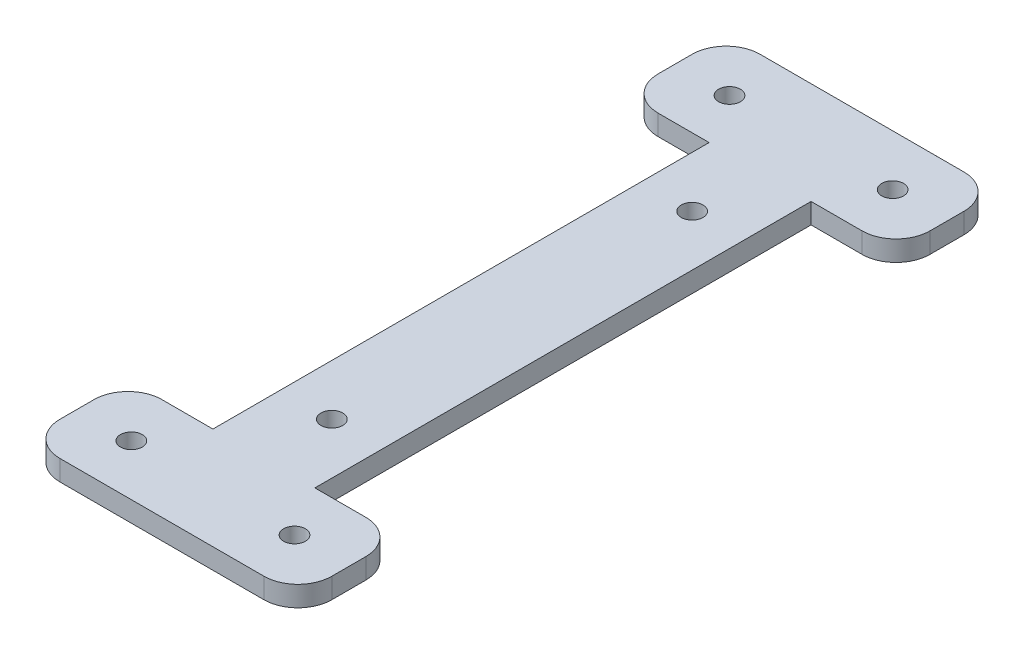
ISO-10303-21;
HEADER;
FILE_DESCRIPTION(('STEP AP214'),'2;1');
FILE_NAME('part.step','',(''),(''),'','','');
FILE_SCHEMA(('AUTOMOTIVE_DESIGN { 1 0 10303 214 1 1 1 1 }'));
ENDSEC;
DATA;
#1=APPLICATION_CONTEXT('core data for automotive mechanical design processes');
#2=APPLICATION_PROTOCOL_DEFINITION('international standard','automotive_design',2000,#1);
#3=PRODUCT_CONTEXT('',#1,'mechanical');
#4=PRODUCT('Part','Part','',(#3));
#5=PRODUCT_RELATED_PRODUCT_CATEGORY('part','',(#4));
#6=PRODUCT_DEFINITION_FORMATION('','',#4);
#7=PRODUCT_DEFINITION_CONTEXT('part definition',#1,'design');
#8=PRODUCT_DEFINITION('design','',#6,#7);
#9=PRODUCT_DEFINITION_SHAPE('','',#8);
#10=(LENGTH_UNIT() NAMED_UNIT(*) SI_UNIT(.MILLI.,.METRE.));
#11=(NAMED_UNIT(*) PLANE_ANGLE_UNIT() SI_UNIT($,.RADIAN.));
#12=(NAMED_UNIT(*) SI_UNIT($,.STERADIAN.) SOLID_ANGLE_UNIT());
#13=UNCERTAINTY_MEASURE_WITH_UNIT(LENGTH_MEASURE(1.E-05),#10,'distance_accuracy_value','');
#14=(GEOMETRIC_REPRESENTATION_CONTEXT(3) GLOBAL_UNCERTAINTY_ASSIGNED_CONTEXT((#13)) GLOBAL_UNIT_ASSIGNED_CONTEXT((#10,
#11,#12)) REPRESENTATION_CONTEXT('',''));
#15=CARTESIAN_POINT('',(0.,0.,0.));
#16=DIRECTION('',(0.,0.,1.));
#17=DIRECTION('',(1.,0.,0.));
#18=AXIS2_PLACEMENT_3D('',#15,#16,#17);
#19=CARTESIAN_POINT('',(40.,3.,0.));
#20=DIRECTION('',(1.,0.,0.));
#21=DIRECTION('',(0.,0.,-1.));
#22=AXIS2_PLACEMENT_3D('',#19,#20,#21);
#23=PLANE('',#22);
#24=DIRECTION('',(0.,0.,1.));
#25=VECTOR('',#24,1.);
#26=CARTESIAN_POINT('',(40.,0.,0.));
#27=LINE('',#26,#25);
#28=CARTESIAN_POINT('',(40.,0.,-98.));
#29=VERTEX_POINT('',#28);
#30=CARTESIAN_POINT('',(40.,0.,-93.));
#31=VERTEX_POINT('',#30);
#32=EDGE_CURVE('E248',#29,#31,#27,.T.);
#33=ORIENTED_EDGE('',*,*,#32,.F.);
#34=DIRECTION('',(0.,-1.,0.));
#35=VECTOR('',#34,1.);
#36=CARTESIAN_POINT('',(40.,3.,-98.));
#37=LINE('',#36,#35);
#38=CARTESIAN_POINT('',(40.,3.,-98.));
#39=VERTEX_POINT('',#38);
#40=EDGE_CURVE('E356',#29,#39,#37,.F.);
#41=ORIENTED_EDGE('',*,*,#40,.T.);
#42=DIRECTION('',(0.,0.,1.));
#43=VECTOR('',#42,1.);
#44=CARTESIAN_POINT('',(40.,3.,0.));
#45=LINE('',#44,#43);
#46=CARTESIAN_POINT('',(40.,3.,-93.));
#47=VERTEX_POINT('',#46);
#48=EDGE_CURVE('E293',#39,#47,#45,.T.);
#49=ORIENTED_EDGE('',*,*,#48,.T.);
#50=DIRECTION('',(0.,-1.,0.));
#51=VECTOR('',#50,1.);
#52=CARTESIAN_POINT('',(40.,0.,-93.));
#53=LINE('',#52,#51);
#54=EDGE_CURVE('E353',#47,#31,#53,.T.);
#55=ORIENTED_EDGE('',*,*,#54,.T.);
#56=EDGE_LOOP('',(#33,#41,#49,#55));
#57=FACE_BOUND('',#56,.T.);
#58=ADVANCED_FACE('F43',(#57),#23,.T.);
#59=CARTESIAN_POINT('',(0.,3.,-103.));
#60=DIRECTION('',(0.,0.,-1.));
#61=DIRECTION('',(-1.,0.,0.));
#62=AXIS2_PLACEMENT_3D('',#59,#60,#61);
#63=PLANE('',#62);
#64=DIRECTION('',(1.,0.,0.));
#65=VECTOR('',#64,1.);
#66=CARTESIAN_POINT('',(0.,0.,-103.));
#67=LINE('',#66,#65);
#68=CARTESIAN_POINT('',(5.,0.,-103.));
#69=VERTEX_POINT('',#68);
#70=CARTESIAN_POINT('',(35.,0.,-103.));
#71=VERTEX_POINT('',#70);
#72=EDGE_CURVE('E251',#69,#71,#67,.T.);
#73=ORIENTED_EDGE('',*,*,#72,.F.);
#74=DIRECTION('',(0.,-1.,0.));
#75=VECTOR('',#74,1.);
#76=CARTESIAN_POINT('',(5.,3.,-103.));
#77=LINE('',#76,#75);
#78=CARTESIAN_POINT('',(5.,3.,-103.));
#79=VERTEX_POINT('',#78);
#80=EDGE_CURVE('E322',#69,#79,#77,.F.);
#81=ORIENTED_EDGE('',*,*,#80,.T.);
#82=DIRECTION('',(1.,0.,0.));
#83=VECTOR('',#82,1.);
#84=CARTESIAN_POINT('',(0.,3.,-103.));
#85=LINE('',#84,#83);
#86=CARTESIAN_POINT('',(35.,3.,-103.));
#87=VERTEX_POINT('',#86);
#88=EDGE_CURVE('E415',#79,#87,#85,.T.);
#89=ORIENTED_EDGE('',*,*,#88,.T.);
#90=DIRECTION('',(0.,-1.,0.));
#91=VECTOR('',#90,1.);
#92=CARTESIAN_POINT('',(35.,3.,-103.));
#93=LINE('',#92,#91);
#94=EDGE_CURVE('E319',#87,#71,#93,.T.);
#95=ORIENTED_EDGE('',*,*,#94,.T.);
#96=EDGE_LOOP('',(#73,#81,#89,#95));
#97=FACE_BOUND('',#96,.T.);
#98=ADVANCED_FACE('F413',(#97),#63,.T.);
#99=CARTESIAN_POINT('',(0.,3.,0.));
#100=DIRECTION('',(1.,0.,0.));
#101=DIRECTION('',(0.,0.,-1.));
#102=AXIS2_PLACEMENT_3D('',#99,#100,#101);
#103=PLANE('',#102);
#104=DIRECTION('',(0.,0.,1.));
#105=VECTOR('',#104,1.);
#106=CARTESIAN_POINT('',(0.,3.,0.));
#107=LINE('',#106,#105);
#108=CARTESIAN_POINT('',(0.,3.,-98.));
#109=VERTEX_POINT('',#108);
#110=CARTESIAN_POINT('',(0.,3.,-93.));
#111=VERTEX_POINT('',#110);
#112=EDGE_CURVE('E196',#109,#111,#107,.T.);
#113=ORIENTED_EDGE('',*,*,#112,.F.);
#114=DIRECTION('',(0.,-1.,0.));
#115=VECTOR('',#114,1.);
#116=CARTESIAN_POINT('',(0.,0.,-98.));
#117=LINE('',#116,#115);
#118=CARTESIAN_POINT('',(0.,0.,-98.));
#119=VERTEX_POINT('',#118);
#120=EDGE_CURVE('E300',#109,#119,#117,.T.);
#121=ORIENTED_EDGE('',*,*,#120,.T.);
#122=DIRECTION('',(0.,0.,1.));
#123=VECTOR('',#122,1.);
#124=CARTESIAN_POINT('',(0.,0.,0.));
#125=LINE('',#124,#123);
#126=CARTESIAN_POINT('',(0.,0.,-93.));
#127=VERTEX_POINT('',#126);
#128=EDGE_CURVE('E254',#119,#127,#125,.T.);
#129=ORIENTED_EDGE('',*,*,#128,.T.);
#130=DIRECTION('',(0.,-1.,0.));
#131=VECTOR('',#130,1.);
#132=CARTESIAN_POINT('',(0.,3.,-93.));
#133=LINE('',#132,#131);
#134=EDGE_CURVE('E207',#127,#111,#133,.F.);
#135=ORIENTED_EDGE('',*,*,#134,.T.);
#136=EDGE_LOOP('',(#113,#121,#129,#135));
#137=FACE_BOUND('',#136,.T.);
#138=ADVANCED_FACE('F446',(#137),#103,.F.);
#139=CARTESIAN_POINT('',(0.,3.,-88.));
#140=DIRECTION('',(0.,0.,-1.));
#141=DIRECTION('',(-1.,0.,0.));
#142=AXIS2_PLACEMENT_3D('',#139,#140,#141);
#143=PLANE('',#142);
#144=DIRECTION('',(1.,0.,0.));
#145=VECTOR('',#144,1.);
#146=CARTESIAN_POINT('',(0.,3.,-88.));
#147=LINE('',#146,#145);
#148=CARTESIAN_POINT('',(5.,3.,-88.));
#149=VERTEX_POINT('',#148);
#150=CARTESIAN_POINT('',(12.5,3.,-88.));
#151=VERTEX_POINT('',#150);
#152=EDGE_CURVE('E182',#149,#151,#147,.T.);
#153=ORIENTED_EDGE('',*,*,#152,.F.);
#154=DIRECTION('',(0.,-1.,0.));
#155=VECTOR('',#154,1.);
#156=CARTESIAN_POINT('',(5.,3.,-88.));
#157=LINE('',#156,#155);
#158=CARTESIAN_POINT('',(5.,0.,-88.));
#159=VERTEX_POINT('',#158);
#160=EDGE_CURVE('E358',#149,#159,#157,.T.);
#161=ORIENTED_EDGE('',*,*,#160,.T.);
#162=DIRECTION('',(1.,0.,0.));
#163=VECTOR('',#162,1.);
#164=CARTESIAN_POINT('',(0.,0.,-88.));
#165=LINE('',#164,#163);
#166=CARTESIAN_POINT('',(12.5,0.,-88.));
#167=VERTEX_POINT('',#166);
#168=EDGE_CURVE('E203',#159,#167,#165,.T.);
#169=ORIENTED_EDGE('',*,*,#168,.T.);
#170=DIRECTION('',(0.,-1.,0.));
#171=VECTOR('',#170,1.);
#172=CARTESIAN_POINT('',(12.5,3.,-88.));
#173=LINE('',#172,#171);
#174=EDGE_CURVE('E200',#151,#167,#173,.T.);
#175=ORIENTED_EDGE('',*,*,#174,.F.);
#176=EDGE_LOOP('',(#153,#161,#169,#175));
#177=FACE_BOUND('',#176,.T.);
#178=ADVANCED_FACE('F201',(#177),#143,.F.);
#179=CARTESIAN_POINT('',(12.5,3.,0.));
#180=DIRECTION('',(-1.,0.,0.));
#181=DIRECTION('',(0.,0.,1.));
#182=AXIS2_PLACEMENT_3D('',#179,#180,#181);
#183=PLANE('',#182);
#184=DIRECTION('',(0.,0.,-1.));
#185=VECTOR('',#184,1.);
#186=CARTESIAN_POINT('',(12.5,0.,0.));
#187=LINE('',#186,#185);
#188=CARTESIAN_POINT('',(12.5,0.,-15.));
#189=VERTEX_POINT('',#188);
#190=EDGE_CURVE('E258',#189,#167,#187,.T.);
#191=ORIENTED_EDGE('',*,*,#190,.F.);
#192=DIRECTION('',(0.,-1.,0.));
#193=VECTOR('',#192,1.);
#194=CARTESIAN_POINT('',(12.5,3.,-15.));
#195=LINE('',#194,#193);
#196=CARTESIAN_POINT('',(12.5,3.,-15.));
#197=VERTEX_POINT('',#196);
#198=EDGE_CURVE('E208',#197,#189,#195,.T.);
#199=ORIENTED_EDGE('',*,*,#198,.F.);
#200=DIRECTION('',(0.,0.,-1.));
#201=VECTOR('',#200,1.);
#202=CARTESIAN_POINT('',(12.5,3.,0.));
#203=LINE('',#202,#201);
#204=EDGE_CURVE('E189',#197,#151,#203,.T.);
#205=ORIENTED_EDGE('',*,*,#204,.T.);
#206=ORIENTED_EDGE('',*,*,#174,.T.);
#207=EDGE_LOOP('',(#191,#199,#205,#206));
#208=FACE_BOUND('',#207,.T.);
#209=ADVANCED_FACE('F211',(#208),#183,.T.);
#210=CARTESIAN_POINT('',(0.,3.,-15.));
#211=DIRECTION('',(0.,0.,-1.));
#212=DIRECTION('',(-1.,0.,0.));
#213=AXIS2_PLACEMENT_3D('',#210,#211,#212);
#214=PLANE('',#213);
#215=DIRECTION('',(1.,0.,0.));
#216=VECTOR('',#215,1.);
#217=CARTESIAN_POINT('',(0.,0.,-15.));
#218=LINE('',#217,#216);
#219=CARTESIAN_POINT('',(5.,0.,-15.));
#220=VERTEX_POINT('',#219);
#221=EDGE_CURVE('E261',#220,#189,#218,.T.);
#222=ORIENTED_EDGE('',*,*,#221,.F.);
#223=DIRECTION('',(0.,-1.,0.));
#224=VECTOR('',#223,1.);
#225=CARTESIAN_POINT('',(5.,3.,-15.));
#226=LINE('',#225,#224);
#227=CARTESIAN_POINT('',(5.,3.,-15.));
#228=VERTEX_POINT('',#227);
#229=EDGE_CURVE('E351',#220,#228,#226,.F.);
#230=ORIENTED_EDGE('',*,*,#229,.T.);
#231=DIRECTION('',(1.,0.,0.));
#232=VECTOR('',#231,1.);
#233=CARTESIAN_POINT('',(0.,3.,-15.));
#234=LINE('',#233,#232);
#235=EDGE_CURVE('E213',#228,#197,#234,.T.);
#236=ORIENTED_EDGE('',*,*,#235,.T.);
#237=ORIENTED_EDGE('',*,*,#198,.T.);
#238=EDGE_LOOP('',(#222,#230,#236,#237));
#239=FACE_BOUND('',#238,.T.);
#240=ADVANCED_FACE('F428',(#239),#214,.T.);
#241=CARTESIAN_POINT('',(0.,3.,0.));
#242=DIRECTION('',(-1.,0.,0.));
#243=DIRECTION('',(0.,0.,1.));
#244=AXIS2_PLACEMENT_3D('',#241,#242,#243);
#245=PLANE('',#244);
#246=DIRECTION('',(0.,0.,-1.));
#247=VECTOR('',#246,1.);
#248=CARTESIAN_POINT('',(0.,3.,0.));
#249=LINE('',#248,#247);
#250=CARTESIAN_POINT('',(0.,3.,-5.));
#251=VERTEX_POINT('',#250);
#252=CARTESIAN_POINT('',(0.,3.,-10.));
#253=VERTEX_POINT('',#252);
#254=EDGE_CURVE('E215',#251,#253,#249,.T.);
#255=ORIENTED_EDGE('',*,*,#254,.T.);
#256=DIRECTION('',(0.,-1.,0.));
#257=VECTOR('',#256,1.);
#258=CARTESIAN_POINT('',(0.,3.,-10.));
#259=LINE('',#258,#257);
#260=CARTESIAN_POINT('',(0.,0.,-10.));
#261=VERTEX_POINT('',#260);
#262=EDGE_CURVE('E348',#253,#261,#259,.T.);
#263=ORIENTED_EDGE('',*,*,#262,.T.);
#264=DIRECTION('',(0.,0.,-1.));
#265=VECTOR('',#264,1.);
#266=CARTESIAN_POINT('',(0.,0.,0.));
#267=LINE('',#266,#265);
#268=CARTESIAN_POINT('',(0.,0.,-5.));
#269=VERTEX_POINT('',#268);
#270=EDGE_CURVE('E263',#269,#261,#267,.T.);
#271=ORIENTED_EDGE('',*,*,#270,.F.);
#272=DIRECTION('',(0.,-1.,0.));
#273=VECTOR('',#272,1.);
#274=CARTESIAN_POINT('',(0.,3.,-5.));
#275=LINE('',#274,#273);
#276=EDGE_CURVE('E346',#269,#251,#275,.F.);
#277=ORIENTED_EDGE('',*,*,#276,.T.);
#278=EDGE_LOOP('',(#255,#263,#271,#277));
#279=FACE_BOUND('',#278,.T.);
#280=ADVANCED_FACE('F435',(#279),#245,.T.);
#281=CARTESIAN_POINT('',(0.,3.,0.));
#282=DIRECTION('',(0.,0.,-1.));
#283=DIRECTION('',(-1.,0.,0.));
#284=AXIS2_PLACEMENT_3D('',#281,#282,#283);
#285=PLANE('',#284);
#286=DIRECTION('',(1.,0.,0.));
#287=VECTOR('',#286,1.);
#288=CARTESIAN_POINT('',(0.,0.,0.));
#289=LINE('',#288,#287);
#290=CARTESIAN_POINT('',(5.,0.,0.));
#291=VERTEX_POINT('',#290);
#292=CARTESIAN_POINT('',(35.,0.,0.));
#293=VERTEX_POINT('',#292);
#294=EDGE_CURVE('E267',#291,#293,#289,.T.);
#295=ORIENTED_EDGE('',*,*,#294,.T.);
#296=DIRECTION('',(0.,-1.,0.));
#297=VECTOR('',#296,1.);
#298=CARTESIAN_POINT('',(35.,3.,0.));
#299=LINE('',#298,#297);
#300=CARTESIAN_POINT('',(35.,3.,0.));
#301=VERTEX_POINT('',#300);
#302=EDGE_CURVE('E11',#293,#301,#299,.F.);
#303=ORIENTED_EDGE('',*,*,#302,.T.);
#304=DIRECTION('',(1.,0.,0.));
#305=VECTOR('',#304,1.);
#306=CARTESIAN_POINT('',(0.,3.,0.));
#307=LINE('',#306,#305);
#308=CARTESIAN_POINT('',(5.,3.,0.));
#309=VERTEX_POINT('',#308);
#310=EDGE_CURVE('E222',#309,#301,#307,.T.);
#311=ORIENTED_EDGE('',*,*,#310,.F.);
#312=DIRECTION('',(0.,-1.,0.));
#313=VECTOR('',#312,1.);
#314=CARTESIAN_POINT('',(5.,0.,0.));
#315=LINE('',#314,#313);
#316=EDGE_CURVE('E51',#309,#291,#315,.T.);
#317=ORIENTED_EDGE('',*,*,#316,.T.);
#318=EDGE_LOOP('',(#295,#303,#311,#317));
#319=FACE_BOUND('',#318,.T.);
#320=ADVANCED_FACE('F365',(#319),#285,.F.);
#321=CARTESIAN_POINT('',(40.,3.,0.));
#322=DIRECTION('',(-1.,0.,0.));
#323=DIRECTION('',(0.,0.,1.));
#324=AXIS2_PLACEMENT_3D('',#321,#322,#323);
#325=PLANE('',#324);
#326=DIRECTION('',(0.,0.,-1.));
#327=VECTOR('',#326,1.);
#328=CARTESIAN_POINT('',(40.,0.,0.));
#329=LINE('',#328,#327);
#330=CARTESIAN_POINT('',(40.,0.,-5.00000000000001));
#331=VERTEX_POINT('',#330);
#332=CARTESIAN_POINT('',(40.,0.,-10.));
#333=VERTEX_POINT('',#332);
#334=EDGE_CURVE('E270',#331,#333,#329,.T.);
#335=ORIENTED_EDGE('',*,*,#334,.T.);
#336=DIRECTION('',(0.,-1.,0.));
#337=VECTOR('',#336,1.);
#338=CARTESIAN_POINT('',(40.,3.,-10.));
#339=LINE('',#338,#337);
#340=CARTESIAN_POINT('',(40.,3.,-10.));
#341=VERTEX_POINT('',#340);
#342=EDGE_CURVE('E344',#333,#341,#339,.F.);
#343=ORIENTED_EDGE('',*,*,#342,.T.);
#344=DIRECTION('',(0.,0.,-1.));
#345=VECTOR('',#344,1.);
#346=CARTESIAN_POINT('',(40.,3.,0.));
#347=LINE('',#346,#345);
#348=CARTESIAN_POINT('',(40.,3.,-5.00000000000001));
#349=VERTEX_POINT('',#348);
#350=EDGE_CURVE('E225',#349,#341,#347,.T.);
#351=ORIENTED_EDGE('',*,*,#350,.F.);
#352=DIRECTION('',(0.,-1.,0.));
#353=VECTOR('',#352,1.);
#354=CARTESIAN_POINT('',(40.,3.,-5.00000000000001));
#355=LINE('',#354,#353);
#356=EDGE_CURVE('E341',#349,#331,#355,.T.);
#357=ORIENTED_EDGE('',*,*,#356,.T.);
#358=EDGE_LOOP('',(#335,#343,#351,#357));
#359=FACE_BOUND('',#358,.T.);
#360=ADVANCED_FACE('F381',(#359),#325,.F.);
#361=CARTESIAN_POINT('',(27.5,3.,-15.));
#362=VERTEX_POINT('',#361);
#363=CARTESIAN_POINT('',(35.,3.,-15.));
#364=VERTEX_POINT('',#363);
#365=EDGE_CURVE('E217',#362,#364,#234,.T.);
#366=ORIENTED_EDGE('',*,*,#365,.T.);
#367=DIRECTION('',(0.,-1.,0.));
#368=VECTOR('',#367,1.);
#369=CARTESIAN_POINT('',(35.,0.,-15.));
#370=LINE('',#369,#368);
#371=CARTESIAN_POINT('',(35.,0.,-15.));
#372=VERTEX_POINT('',#371);
#373=EDGE_CURVE('E338',#364,#372,#370,.T.);
#374=ORIENTED_EDGE('',*,*,#373,.T.);
#375=CARTESIAN_POINT('',(27.5,0.,-15.));
#376=VERTEX_POINT('',#375);
#377=EDGE_CURVE('E264',#376,#372,#218,.T.);
#378=ORIENTED_EDGE('',*,*,#377,.F.);
#379=DIRECTION('',(0.,-1.,0.));
#380=VECTOR('',#379,1.);
#381=CARTESIAN_POINT('',(27.5,3.,-15.));
#382=LINE('',#381,#380);
#383=EDGE_CURVE('E296',#362,#376,#382,.T.);
#384=ORIENTED_EDGE('',*,*,#383,.F.);
#385=EDGE_LOOP('',(#366,#374,#378,#384));
#386=FACE_BOUND('',#385,.T.);
#387=ADVANCED_FACE('F389',(#386),#214,.T.);
#388=CARTESIAN_POINT('',(27.5,3.,0.));
#389=DIRECTION('',(-1.,0.,0.));
#390=DIRECTION('',(0.,0.,1.));
#391=AXIS2_PLACEMENT_3D('',#388,#389,#390);
#392=PLANE('',#391);
#393=DIRECTION('',(0.,0.,-1.));
#394=VECTOR('',#393,1.);
#395=CARTESIAN_POINT('',(27.5,0.,0.));
#396=LINE('',#395,#394);
#397=CARTESIAN_POINT('',(27.5,0.,-88.));
#398=VERTEX_POINT('',#397);
#399=EDGE_CURVE('E273',#376,#398,#396,.T.);
#400=ORIENTED_EDGE('',*,*,#399,.T.);
#401=DIRECTION('',(0.,-1.,0.));
#402=VECTOR('',#401,1.);
#403=CARTESIAN_POINT('',(27.5,3.,-88.));
#404=LINE('',#403,#402);
#405=CARTESIAN_POINT('',(27.5,3.,-88.));
#406=VERTEX_POINT('',#405);
#407=EDGE_CURVE('E247',#406,#398,#404,.T.);
#408=ORIENTED_EDGE('',*,*,#407,.F.);
#409=DIRECTION('',(0.,0.,-1.));
#410=VECTOR('',#409,1.);
#411=CARTESIAN_POINT('',(27.5,3.,0.));
#412=LINE('',#411,#410);
#413=EDGE_CURVE('E227',#362,#406,#412,.T.);
#414=ORIENTED_EDGE('',*,*,#413,.F.);
#415=ORIENTED_EDGE('',*,*,#383,.T.);
#416=EDGE_LOOP('',(#400,#408,#414,#415));
#417=FACE_BOUND('',#416,.T.);
#418=ADVANCED_FACE('F394',(#417),#392,.F.);
#419=CARTESIAN_POINT('',(8.,3.,-7.50000000000001));
#420=DIRECTION('',(0.,-1.,0.));
#421=DIRECTION('',(0.,0.,-1.));
#422=AXIS2_PLACEMENT_3D('',#419,#420,#421);
#423=CYLINDRICAL_SURFACE('',#422,1.6);
#424=CARTESIAN_POINT('',(8.,3.,-7.50000000000001));
#425=DIRECTION('',(0.,1.,0.));
#426=DIRECTION('',(0.,0.,1.));
#427=AXIS2_PLACEMENT_3D('',#424,#425,#426);
#428=CIRCLE('',#427,1.6);
#429=CARTESIAN_POINT('',(8.,3.,-5.9));
#430=VERTEX_POINT('',#429);
#431=EDGE_CURVE('E241',#430,#430,#428,.T.);
#432=ORIENTED_EDGE('',*,*,#431,.T.);
#433=EDGE_LOOP('',(#432));
#434=FACE_BOUND('',#433,.T.);
#435=CARTESIAN_POINT('',(8.,0.,-7.50000000000001));
#436=DIRECTION('',(0.,1.,0.));
#437=DIRECTION('',(0.,0.,1.));
#438=AXIS2_PLACEMENT_3D('',#435,#436,#437);
#439=CIRCLE('',#438,1.6);
#440=CARTESIAN_POINT('',(8.,0.,-5.9));
#441=VERTEX_POINT('',#440);
#442=EDGE_CURVE('E287',#441,#441,#439,.T.);
#443=ORIENTED_EDGE('',*,*,#442,.F.);
#444=EDGE_LOOP('',(#443));
#445=FACE_BOUND('',#444,.T.);
#446=ADVANCED_FACE('F588',(#434,#445),#423,.F.);
#447=CARTESIAN_POINT('',(20.,3.,-78.));
#448=DIRECTION('',(0.,-1.,0.));
#449=DIRECTION('',(0.,0.,-1.));
#450=AXIS2_PLACEMENT_3D('',#447,#448,#449);
#451=CYLINDRICAL_SURFACE('',#450,1.60000000000001);
#452=CARTESIAN_POINT('',(20.,3.,-78.));
#453=DIRECTION('',(0.,1.,0.));
#454=DIRECTION('',(0.,0.,1.));
#455=AXIS2_PLACEMENT_3D('',#452,#453,#454);
#456=CIRCLE('',#455,1.60000000000001);
#457=CARTESIAN_POINT('',(20.,3.,-76.4));
#458=VERTEX_POINT('',#457);
#459=EDGE_CURVE('E238',#458,#458,#456,.T.);
#460=ORIENTED_EDGE('',*,*,#459,.T.);
#461=EDGE_LOOP('',(#460));
#462=FACE_BOUND('',#461,.T.);
#463=CARTESIAN_POINT('',(20.,0.,-78.));
#464=DIRECTION('',(0.,1.,0.));
#465=DIRECTION('',(0.,0.,1.));
#466=AXIS2_PLACEMENT_3D('',#463,#464,#465);
#467=CIRCLE('',#466,1.60000000000001);
#468=CARTESIAN_POINT('',(20.,0.,-76.4));
#469=VERTEX_POINT('',#468);
#470=EDGE_CURVE('E284',#469,#469,#467,.T.);
#471=ORIENTED_EDGE('',*,*,#470,.F.);
#472=EDGE_LOOP('',(#471));
#473=FACE_BOUND('',#472,.T.);
#474=ADVANCED_FACE('F578',(#462,#473),#451,.F.);
#475=CARTESIAN_POINT('',(20.,3.,-25.));
#476=DIRECTION('',(0.,-1.,0.));
#477=DIRECTION('',(0.,0.,-1.));
#478=AXIS2_PLACEMENT_3D('',#475,#476,#477);
#479=CYLINDRICAL_SURFACE('',#478,1.6);
#480=CARTESIAN_POINT('',(20.,3.,-25.));
#481=DIRECTION('',(0.,1.,0.));
#482=DIRECTION('',(0.,0.,1.));
#483=AXIS2_PLACEMENT_3D('',#480,#481,#482);
#484=CIRCLE('',#483,1.6);
#485=CARTESIAN_POINT('',(20.,3.,-23.4));
#486=VERTEX_POINT('',#485);
#487=EDGE_CURVE('E235',#486,#486,#484,.T.);
#488=ORIENTED_EDGE('',*,*,#487,.T.);
#489=EDGE_LOOP('',(#488));
#490=FACE_BOUND('',#489,.T.);
#491=CARTESIAN_POINT('',(20.,0.,-25.));
#492=DIRECTION('',(0.,1.,0.));
#493=DIRECTION('',(0.,0.,1.));
#494=AXIS2_PLACEMENT_3D('',#491,#492,#493);
#495=CIRCLE('',#494,1.6);
#496=CARTESIAN_POINT('',(20.,0.,-23.4));
#497=VERTEX_POINT('',#496);
#498=EDGE_CURVE('E281',#497,#497,#495,.T.);
#499=ORIENTED_EDGE('',*,*,#498,.F.);
#500=EDGE_LOOP('',(#499));
#501=FACE_BOUND('',#500,.T.);
#502=ADVANCED_FACE('F568',(#490,#501),#479,.F.);
#503=CARTESIAN_POINT('',(32.,3.,-95.5));
#504=DIRECTION('',(0.,-1.,0.));
#505=DIRECTION('',(0.,0.,-1.));
#506=AXIS2_PLACEMENT_3D('',#503,#504,#505);
#507=CYLINDRICAL_SURFACE('',#506,1.6);
#508=CARTESIAN_POINT('',(32.,3.,-95.5));
#509=DIRECTION('',(0.,1.,0.));
#510=DIRECTION('',(0.,0.,1.));
#511=AXIS2_PLACEMENT_3D('',#508,#509,#510);
#512=CIRCLE('',#511,1.6);
#513=CARTESIAN_POINT('',(32.,3.,-93.9));
#514=VERTEX_POINT('',#513);
#515=EDGE_CURVE('E232',#514,#514,#512,.F.);
#516=ORIENTED_EDGE('',*,*,#515,.F.);
#517=EDGE_LOOP('',(#516));
#518=FACE_BOUND('',#517,.T.);
#519=CARTESIAN_POINT('',(32.,0.,-95.5));
#520=DIRECTION('',(0.,1.,0.));
#521=DIRECTION('',(0.,0.,1.));
#522=AXIS2_PLACEMENT_3D('',#519,#520,#521);
#523=CIRCLE('',#522,1.6);
#524=CARTESIAN_POINT('',(32.,0.,-93.9));
#525=VERTEX_POINT('',#524);
#526=EDGE_CURVE('E278',#525,#525,#523,.F.);
#527=ORIENTED_EDGE('',*,*,#526,.T.);
#528=EDGE_LOOP('',(#527));
#529=FACE_BOUND('',#528,.T.);
#530=ADVANCED_FACE('F558',(#518,#529),#507,.F.);
#531=CARTESIAN_POINT('',(8.,3.,-95.5));
#532=DIRECTION('',(0.,-1.,0.));
#533=DIRECTION('',(0.,0.,-1.));
#534=AXIS2_PLACEMENT_3D('',#531,#532,#533);
#535=CYLINDRICAL_SURFACE('',#534,1.6);
#536=CARTESIAN_POINT('',(8.,3.,-95.5));
#537=DIRECTION('',(0.,1.,0.));
#538=DIRECTION('',(0.,0.,1.));
#539=AXIS2_PLACEMENT_3D('',#536,#537,#538);
#540=CIRCLE('',#539,1.6);
#541=CARTESIAN_POINT('',(8.,3.,-93.9));
#542=VERTEX_POINT('',#541);
#543=EDGE_CURVE('E229',#542,#542,#540,.T.);
#544=ORIENTED_EDGE('',*,*,#543,.T.);
#545=EDGE_LOOP('',(#544));
#546=FACE_BOUND('',#545,.T.);
#547=CARTESIAN_POINT('',(8.,0.,-95.5));
#548=DIRECTION('',(0.,1.,0.));
#549=DIRECTION('',(0.,0.,1.));
#550=AXIS2_PLACEMENT_3D('',#547,#548,#549);
#551=CIRCLE('',#550,1.6);
#552=CARTESIAN_POINT('',(8.,0.,-93.9));
#553=VERTEX_POINT('',#552);
#554=EDGE_CURVE('E275',#553,#553,#551,.T.);
#555=ORIENTED_EDGE('',*,*,#554,.F.);
#556=EDGE_LOOP('',(#555));
#557=FACE_BOUND('',#556,.T.);
#558=ADVANCED_FACE('F550',(#546,#557),#535,.F.);
#559=CARTESIAN_POINT('',(35.,0.,-88.));
#560=VERTEX_POINT('',#559);
#561=EDGE_CURVE('E259',#398,#560,#165,.T.);
#562=ORIENTED_EDGE('',*,*,#561,.T.);
#563=DIRECTION('',(0.,-1.,0.));
#564=VECTOR('',#563,1.);
#565=CARTESIAN_POINT('',(35.,3.,-88.));
#566=LINE('',#565,#564);
#567=CARTESIAN_POINT('',(35.,3.,-88.));
#568=VERTEX_POINT('',#567);
#569=EDGE_CURVE('E58',#560,#568,#566,.F.);
#570=ORIENTED_EDGE('',*,*,#569,.T.);
#571=EDGE_CURVE('E198',#406,#568,#147,.T.);
#572=ORIENTED_EDGE('',*,*,#571,.F.);
#573=ORIENTED_EDGE('',*,*,#407,.T.);
#574=EDGE_LOOP('',(#562,#570,#572,#573));
#575=FACE_BOUND('',#574,.T.);
#576=ADVANCED_FACE('F396',(#575),#143,.F.);
#577=CARTESIAN_POINT('',(32.,3.,-7.50000000000001));
#578=DIRECTION('',(0.,-1.,0.));
#579=DIRECTION('',(0.,0.,-1.));
#580=AXIS2_PLACEMENT_3D('',#577,#578,#579);
#581=CYLINDRICAL_SURFACE('',#580,1.6);
#582=CARTESIAN_POINT('',(32.,3.,-7.50000000000001));
#583=DIRECTION('',(0.,1.,0.));
#584=DIRECTION('',(0.,0.,1.));
#585=AXIS2_PLACEMENT_3D('',#582,#583,#584);
#586=CIRCLE('',#585,1.6);
#587=CARTESIAN_POINT('',(32.,3.,-5.9));
#588=VERTEX_POINT('',#587);
#589=EDGE_CURVE('E244',#588,#588,#586,.F.);
#590=ORIENTED_EDGE('',*,*,#589,.F.);
#591=EDGE_LOOP('',(#590));
#592=FACE_BOUND('',#591,.T.);
#593=CARTESIAN_POINT('',(32.,0.,-7.50000000000001));
#594=DIRECTION('',(0.,1.,0.));
#595=DIRECTION('',(0.,0.,1.));
#596=AXIS2_PLACEMENT_3D('',#593,#594,#595);
#597=CIRCLE('',#596,1.6);
#598=CARTESIAN_POINT('',(32.,0.,-5.9));
#599=VERTEX_POINT('',#598);
#600=EDGE_CURVE('E290',#599,#599,#597,.F.);
#601=ORIENTED_EDGE('',*,*,#600,.T.);
#602=EDGE_LOOP('',(#601));
#603=FACE_BOUND('',#602,.T.);
#604=ADVANCED_FACE('F531',(#592,#603),#581,.F.);
#605=CARTESIAN_POINT('',(0.,3.,0.));
#606=DIRECTION('',(0.,1.,0.));
#607=DIRECTION('',(0.,0.,1.));
#608=AXIS2_PLACEMENT_3D('',#605,#606,#607);
#609=PLANE('',#608);
#610=ORIENTED_EDGE('',*,*,#88,.F.);
#611=CARTESIAN_POINT('',(5.,3.,-98.));
#612=DIRECTION('',(0.,1.,0.));
#613=DIRECTION('',(0.,0.,1.));
#614=AXIS2_PLACEMENT_3D('',#611,#612,#613);
#615=CIRCLE('',#614,5.);
#616=EDGE_CURVE('E336',#79,#109,#615,.T.);
#617=ORIENTED_EDGE('',*,*,#616,.T.);
#618=ORIENTED_EDGE('',*,*,#112,.T.);
#619=CARTESIAN_POINT('',(5.,3.,-93.));
#620=DIRECTION('',(0.,1.,0.));
#621=DIRECTION('',(0.,0.,1.));
#622=AXIS2_PLACEMENT_3D('',#619,#620,#621);
#623=CIRCLE('',#622,5.);
#624=EDGE_CURVE('E192',#111,#149,#623,.T.);
#625=ORIENTED_EDGE('',*,*,#624,.T.);
#626=ORIENTED_EDGE('',*,*,#152,.T.);
#627=ORIENTED_EDGE('',*,*,#204,.F.);
#628=ORIENTED_EDGE('',*,*,#235,.F.);
#629=CARTESIAN_POINT('',(5.,3.,-10.));
#630=DIRECTION('',(0.,1.,0.));
#631=DIRECTION('',(0.,0.,1.));
#632=AXIS2_PLACEMENT_3D('',#629,#630,#631);
#633=CIRCLE('',#632,5.);
#634=EDGE_CURVE('E333',#228,#253,#633,.T.);
#635=ORIENTED_EDGE('',*,*,#634,.T.);
#636=ORIENTED_EDGE('',*,*,#254,.F.);
#637=CARTESIAN_POINT('',(5.,3.,-5.));
#638=DIRECTION('',(0.,1.,0.));
#639=DIRECTION('',(0.,0.,1.));
#640=AXIS2_PLACEMENT_3D('',#637,#638,#639);
#641=CIRCLE('',#640,5.);
#642=EDGE_CURVE('E324',#251,#309,#641,.T.);
#643=ORIENTED_EDGE('',*,*,#642,.T.);
#644=ORIENTED_EDGE('',*,*,#310,.T.);
#645=CARTESIAN_POINT('',(35.,3.,-5.));
#646=DIRECTION('',(0.,1.,0.));
#647=DIRECTION('',(0.,0.,1.));
#648=AXIS2_PLACEMENT_3D('',#645,#646,#647);
#649=CIRCLE('',#648,5.);
#650=EDGE_CURVE('E326',#301,#349,#649,.T.);
#651=ORIENTED_EDGE('',*,*,#650,.T.);
#652=ORIENTED_EDGE('',*,*,#350,.T.);
#653=CARTESIAN_POINT('',(35.,3.,-10.));
#654=DIRECTION('',(0.,1.,0.));
#655=DIRECTION('',(0.,0.,1.));
#656=AXIS2_PLACEMENT_3D('',#653,#654,#655);
#657=CIRCLE('',#656,5.);
#658=EDGE_CURVE('E66',#341,#364,#657,.T.);
#659=ORIENTED_EDGE('',*,*,#658,.T.);
#660=ORIENTED_EDGE('',*,*,#365,.F.);
#661=ORIENTED_EDGE('',*,*,#413,.T.);
#662=ORIENTED_EDGE('',*,*,#571,.T.);
#663=CARTESIAN_POINT('',(35.,3.,-93.));
#664=DIRECTION('',(0.,1.,0.));
#665=DIRECTION('',(0.,0.,1.));
#666=AXIS2_PLACEMENT_3D('',#663,#664,#665);
#667=CIRCLE('',#666,5.);
#668=EDGE_CURVE('E328',#568,#47,#667,.T.);
#669=ORIENTED_EDGE('',*,*,#668,.T.);
#670=ORIENTED_EDGE('',*,*,#48,.F.);
#671=CARTESIAN_POINT('',(35.,3.,-98.));
#672=DIRECTION('',(0.,1.,0.));
#673=DIRECTION('',(0.,0.,1.));
#674=AXIS2_PLACEMENT_3D('',#671,#672,#673);
#675=CIRCLE('',#674,5.);
#676=EDGE_CURVE('E331',#39,#87,#675,.T.);
#677=ORIENTED_EDGE('',*,*,#676,.T.);
#678=EDGE_LOOP('',(#610,#617,#618,#625,#626,#627,#628,#635,#636,#643,#644,#651,#652,#659,#660,
#661,#662,#669,#670,#677));
#679=FACE_BOUND('',#678,.T.);
#680=ORIENTED_EDGE('',*,*,#543,.F.);
#681=EDGE_LOOP('',(#680));
#682=FACE_BOUND('',#681,.T.);
#683=ORIENTED_EDGE('',*,*,#515,.T.);
#684=EDGE_LOOP('',(#683));
#685=FACE_BOUND('',#684,.T.);
#686=ORIENTED_EDGE('',*,*,#487,.F.);
#687=EDGE_LOOP('',(#686));
#688=FACE_BOUND('',#687,.T.);
#689=ORIENTED_EDGE('',*,*,#459,.F.);
#690=EDGE_LOOP('',(#689));
#691=FACE_BOUND('',#690,.T.);
#692=ORIENTED_EDGE('',*,*,#431,.F.);
#693=EDGE_LOOP('',(#692));
#694=FACE_BOUND('',#693,.T.);
#695=ORIENTED_EDGE('',*,*,#589,.T.);
#696=EDGE_LOOP('',(#695));
#697=FACE_BOUND('',#696,.T.);
#698=ADVANCED_FACE('F185',(#679,#682,#685,#688,#691,#694,#697),#609,.T.);
#699=CARTESIAN_POINT('',(0.,0.,0.));
#700=DIRECTION('',(0.,1.,0.));
#701=DIRECTION('',(0.,0.,1.));
#702=AXIS2_PLACEMENT_3D('',#699,#700,#701);
#703=PLANE('',#702);
#704=ORIENTED_EDGE('',*,*,#128,.F.);
#705=CARTESIAN_POINT('',(5.,0.,-98.));
#706=DIRECTION('',(0.,1.,0.));
#707=DIRECTION('',(0.,0.,1.));
#708=AXIS2_PLACEMENT_3D('',#705,#706,#707);
#709=CIRCLE('',#708,5.);
#710=EDGE_CURVE('E317',#119,#69,#709,.F.);
#711=ORIENTED_EDGE('',*,*,#710,.T.);
#712=ORIENTED_EDGE('',*,*,#72,.T.);
#713=CARTESIAN_POINT('',(35.,0.,-98.));
#714=DIRECTION('',(0.,1.,0.));
#715=DIRECTION('',(0.,0.,1.));
#716=AXIS2_PLACEMENT_3D('',#713,#714,#715);
#717=CIRCLE('',#716,5.);
#718=EDGE_CURVE('E311',#71,#29,#717,.F.);
#719=ORIENTED_EDGE('',*,*,#718,.T.);
#720=ORIENTED_EDGE('',*,*,#32,.T.);
#721=CARTESIAN_POINT('',(35.,0.,-93.));
#722=DIRECTION('',(0.,1.,0.));
#723=DIRECTION('',(0.,0.,1.));
#724=AXIS2_PLACEMENT_3D('',#721,#722,#723);
#725=CIRCLE('',#724,5.);
#726=EDGE_CURVE('E307',#31,#560,#725,.F.);
#727=ORIENTED_EDGE('',*,*,#726,.T.);
#728=ORIENTED_EDGE('',*,*,#561,.F.);
#729=ORIENTED_EDGE('',*,*,#399,.F.);
#730=ORIENTED_EDGE('',*,*,#377,.T.);
#731=CARTESIAN_POINT('',(35.,0.,-10.));
#732=DIRECTION('',(0.,1.,0.));
#733=DIRECTION('',(0.,0.,1.));
#734=AXIS2_PLACEMENT_3D('',#731,#732,#733);
#735=CIRCLE('',#734,5.);
#736=EDGE_CURVE('E315',#372,#333,#735,.F.);
#737=ORIENTED_EDGE('',*,*,#736,.T.);
#738=ORIENTED_EDGE('',*,*,#334,.F.);
#739=CARTESIAN_POINT('',(35.,0.,-5.));
#740=DIRECTION('',(0.,1.,0.));
#741=DIRECTION('',(0.,0.,1.));
#742=AXIS2_PLACEMENT_3D('',#739,#740,#741);
#743=CIRCLE('',#742,5.);
#744=EDGE_CURVE('E305',#331,#293,#743,.F.);
#745=ORIENTED_EDGE('',*,*,#744,.T.);
#746=ORIENTED_EDGE('',*,*,#294,.F.);
#747=CARTESIAN_POINT('',(5.,0.,-5.));
#748=DIRECTION('',(0.,1.,0.));
#749=DIRECTION('',(0.,0.,1.));
#750=AXIS2_PLACEMENT_3D('',#747,#748,#749);
#751=CIRCLE('',#750,5.);
#752=EDGE_CURVE('E303',#291,#269,#751,.F.);
#753=ORIENTED_EDGE('',*,*,#752,.T.);
#754=ORIENTED_EDGE('',*,*,#270,.T.);
#755=CARTESIAN_POINT('',(5.,0.,-10.));
#756=DIRECTION('',(0.,1.,0.));
#757=DIRECTION('',(0.,0.,1.));
#758=AXIS2_PLACEMENT_3D('',#755,#756,#757);
#759=CIRCLE('',#758,5.);
#760=EDGE_CURVE('E313',#261,#220,#759,.F.);
#761=ORIENTED_EDGE('',*,*,#760,.T.);
#762=ORIENTED_EDGE('',*,*,#221,.T.);
#763=ORIENTED_EDGE('',*,*,#190,.T.);
#764=ORIENTED_EDGE('',*,*,#168,.F.);
#765=CARTESIAN_POINT('',(5.,0.,-93.));
#766=DIRECTION('',(0.,1.,0.));
#767=DIRECTION('',(0.,0.,1.));
#768=AXIS2_PLACEMENT_3D('',#765,#766,#767);
#769=CIRCLE('',#768,5.);
#770=EDGE_CURVE('E309',#159,#127,#769,.F.);
#771=ORIENTED_EDGE('',*,*,#770,.T.);
#772=EDGE_LOOP('',(#704,#711,#712,#719,#720,#727,#728,#729,#730,#737,#738,#745,#746,#753,#754,
#761,#762,#763,#764,#771));
#773=FACE_BOUND('',#772,.T.);
#774=ORIENTED_EDGE('',*,*,#554,.T.);
#775=EDGE_LOOP('',(#774));
#776=FACE_BOUND('',#775,.T.);
#777=ORIENTED_EDGE('',*,*,#526,.F.);
#778=EDGE_LOOP('',(#777));
#779=FACE_BOUND('',#778,.T.);
#780=ORIENTED_EDGE('',*,*,#498,.T.);
#781=EDGE_LOOP('',(#780));
#782=FACE_BOUND('',#781,.T.);
#783=ORIENTED_EDGE('',*,*,#470,.T.);
#784=EDGE_LOOP('',(#783));
#785=FACE_BOUND('',#784,.T.);
#786=ORIENTED_EDGE('',*,*,#442,.T.);
#787=EDGE_LOOP('',(#786));
#788=FACE_BOUND('',#787,.T.);
#789=ORIENTED_EDGE('',*,*,#600,.F.);
#790=EDGE_LOOP('',(#789));
#791=FACE_BOUND('',#790,.T.);
#792=ADVANCED_FACE('F371',(#773,#776,#779,#782,#785,#788,#791),#703,.F.);
#793=CARTESIAN_POINT('',(5.,3.,-98.));
#794=DIRECTION('',(0.,1.,0.));
#795=DIRECTION('',(0.,0.,1.));
#796=AXIS2_PLACEMENT_3D('',#793,#794,#795);
#797=CYLINDRICAL_SURFACE('',#796,5.);
#798=ORIENTED_EDGE('',*,*,#616,.F.);
#799=ORIENTED_EDGE('',*,*,#80,.F.);
#800=ORIENTED_EDGE('',*,*,#710,.F.);
#801=ORIENTED_EDGE('',*,*,#120,.F.);
#802=EDGE_LOOP('',(#798,#799,#800,#801));
#803=FACE_BOUND('',#802,.T.);
#804=ADVANCED_FACE('F450',(#803),#797,.T.);
#805=CARTESIAN_POINT('',(35.,3.,-10.));
#806=DIRECTION('',(0.,1.,0.));
#807=DIRECTION('',(0.,0.,1.));
#808=AXIS2_PLACEMENT_3D('',#805,#806,#807);
#809=CYLINDRICAL_SURFACE('',#808,5.);
#810=ORIENTED_EDGE('',*,*,#658,.F.);
#811=ORIENTED_EDGE('',*,*,#342,.F.);
#812=ORIENTED_EDGE('',*,*,#736,.F.);
#813=ORIENTED_EDGE('',*,*,#373,.F.);
#814=EDGE_LOOP('',(#810,#811,#812,#813));
#815=FACE_BOUND('',#814,.T.);
#816=ADVANCED_FACE('F385',(#815),#809,.T.);
#817=CARTESIAN_POINT('',(5.,3.,-10.));
#818=DIRECTION('',(0.,-1.,0.));
#819=DIRECTION('',(0.,0.,-1.));
#820=AXIS2_PLACEMENT_3D('',#817,#818,#819);
#821=CYLINDRICAL_SURFACE('',#820,5.);
#822=ORIENTED_EDGE('',*,*,#634,.F.);
#823=ORIENTED_EDGE('',*,*,#229,.F.);
#824=ORIENTED_EDGE('',*,*,#760,.F.);
#825=ORIENTED_EDGE('',*,*,#262,.F.);
#826=EDGE_LOOP('',(#822,#823,#824,#825));
#827=FACE_BOUND('',#826,.T.);
#828=ADVANCED_FACE('F433',(#827),#821,.T.);
#829=CARTESIAN_POINT('',(35.,3.,-98.));
#830=DIRECTION('',(0.,-1.,0.));
#831=DIRECTION('',(0.,0.,-1.));
#832=AXIS2_PLACEMENT_3D('',#829,#830,#831);
#833=CYLINDRICAL_SURFACE('',#832,5.);
#834=ORIENTED_EDGE('',*,*,#676,.F.);
#835=ORIENTED_EDGE('',*,*,#40,.F.);
#836=ORIENTED_EDGE('',*,*,#718,.F.);
#837=ORIENTED_EDGE('',*,*,#94,.F.);
#838=EDGE_LOOP('',(#834,#835,#836,#837));
#839=FACE_BOUND('',#838,.T.);
#840=ADVANCED_FACE('F410',(#839),#833,.T.);
#841=CARTESIAN_POINT('',(5.,3.,-93.));
#842=DIRECTION('',(0.,-1.,0.));
#843=DIRECTION('',(0.,0.,-1.));
#844=AXIS2_PLACEMENT_3D('',#841,#842,#843);
#845=CYLINDRICAL_SURFACE('',#844,5.);
#846=ORIENTED_EDGE('',*,*,#624,.F.);
#847=ORIENTED_EDGE('',*,*,#134,.F.);
#848=ORIENTED_EDGE('',*,*,#770,.F.);
#849=ORIENTED_EDGE('',*,*,#160,.F.);
#850=EDGE_LOOP('',(#846,#847,#848,#849));
#851=FACE_BOUND('',#850,.T.);
#852=ADVANCED_FACE('F424',(#851),#845,.T.);
#853=CARTESIAN_POINT('',(35.,3.,-93.));
#854=DIRECTION('',(0.,1.,0.));
#855=DIRECTION('',(0.,0.,1.));
#856=AXIS2_PLACEMENT_3D('',#853,#854,#855);
#857=CYLINDRICAL_SURFACE('',#856,5.);
#858=ORIENTED_EDGE('',*,*,#668,.F.);
#859=ORIENTED_EDGE('',*,*,#569,.F.);
#860=ORIENTED_EDGE('',*,*,#726,.F.);
#861=ORIENTED_EDGE('',*,*,#54,.F.);
#862=EDGE_LOOP('',(#858,#859,#860,#861));
#863=FACE_BOUND('',#862,.T.);
#864=ADVANCED_FACE('F402',(#863),#857,.T.);
#865=CARTESIAN_POINT('',(35.,3.,-5.));
#866=DIRECTION('',(0.,-1.,0.));
#867=DIRECTION('',(0.,0.,-1.));
#868=AXIS2_PLACEMENT_3D('',#865,#866,#867);
#869=CYLINDRICAL_SURFACE('',#868,5.);
#870=ORIENTED_EDGE('',*,*,#650,.F.);
#871=ORIENTED_EDGE('',*,*,#302,.F.);
#872=ORIENTED_EDGE('',*,*,#744,.F.);
#873=ORIENTED_EDGE('',*,*,#356,.F.);
#874=EDGE_LOOP('',(#870,#871,#872,#873));
#875=FACE_BOUND('',#874,.T.);
#876=ADVANCED_FACE('F378',(#875),#869,.T.);
#877=CARTESIAN_POINT('',(5.,3.,-5.));
#878=DIRECTION('',(0.,1.,0.));
#879=DIRECTION('',(0.,0.,1.));
#880=AXIS2_PLACEMENT_3D('',#877,#878,#879);
#881=CYLINDRICAL_SURFACE('',#880,5.);
#882=ORIENTED_EDGE('',*,*,#642,.F.);
#883=ORIENTED_EDGE('',*,*,#276,.F.);
#884=ORIENTED_EDGE('',*,*,#752,.F.);
#885=ORIENTED_EDGE('',*,*,#316,.F.);
#886=EDGE_LOOP('',(#882,#883,#884,#885));
#887=FACE_BOUND('',#886,.T.);
#888=ADVANCED_FACE('F45',(#887),#881,.T.);
#889=CLOSED_SHELL('',(#58,#98,#138,#178,#209,#240,#280,#320,#360,#387,#418,#446,#474,#502,#530,
#558,#576,#604,#698,#792,#804,#816,#828,#840,#852,#864,#876,#888));
#890=MANIFOLD_SOLID_BREP('B2',#889);
#891=ADVANCED_BREP_SHAPE_REPRESENTATION('',(#18,#890),#14);
#892=SHAPE_DEFINITION_REPRESENTATION(#9,#891);
ENDSEC;
END-ISO-10303-21;
